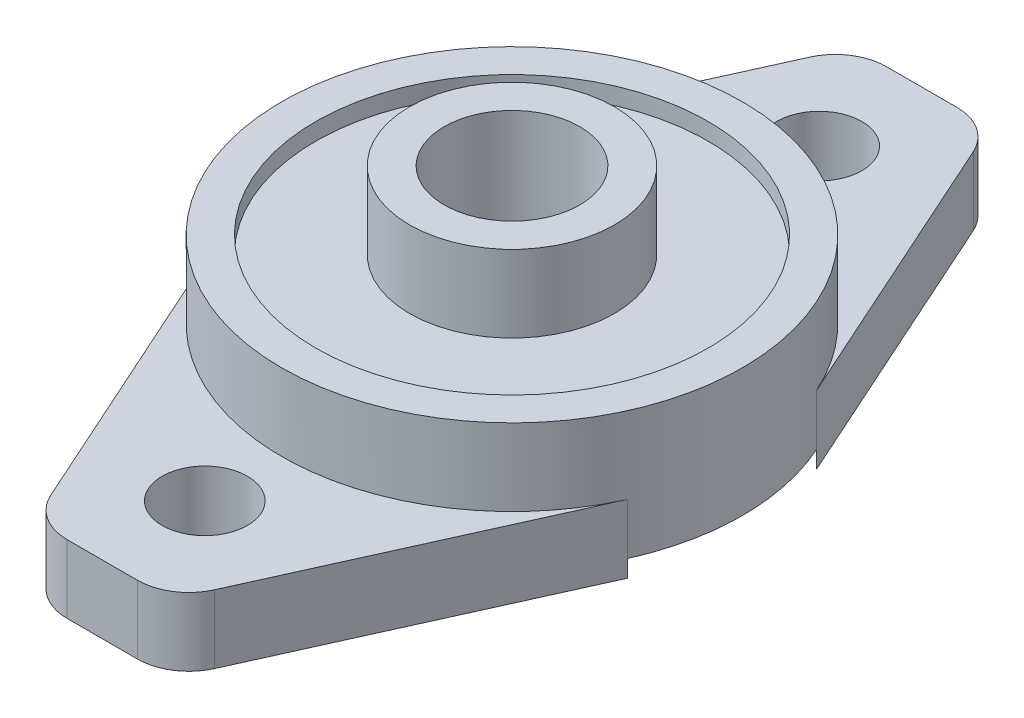
ISO-10303-21;
HEADER;
FILE_DESCRIPTION(('STEP AP214'),'2;1');
FILE_NAME('part.step','',(''),(''),'','','');
FILE_SCHEMA(('AUTOMOTIVE_DESIGN { 1 0 10303 214 1 1 1 1 }'));
ENDSEC;
DATA;
#1=APPLICATION_CONTEXT('core data for automotive mechanical design processes');
#2=APPLICATION_PROTOCOL_DEFINITION('international standard','automotive_design',2000,#1);
#3=PRODUCT_CONTEXT('',#1,'mechanical');
#4=PRODUCT('Part','Part','',(#3));
#5=PRODUCT_RELATED_PRODUCT_CATEGORY('part','',(#4));
#6=PRODUCT_DEFINITION_FORMATION('','',#4);
#7=PRODUCT_DEFINITION_CONTEXT('part definition',#1,'design');
#8=PRODUCT_DEFINITION('design','',#6,#7);
#9=PRODUCT_DEFINITION_SHAPE('','',#8);
#10=(LENGTH_UNIT() NAMED_UNIT(*) SI_UNIT(.MILLI.,.METRE.));
#11=(NAMED_UNIT(*) PLANE_ANGLE_UNIT() SI_UNIT($,.RADIAN.));
#12=(NAMED_UNIT(*) SI_UNIT($,.STERADIAN.) SOLID_ANGLE_UNIT());
#13=UNCERTAINTY_MEASURE_WITH_UNIT(LENGTH_MEASURE(1.E-05),#10,'distance_accuracy_value','');
#14=(GEOMETRIC_REPRESENTATION_CONTEXT(3) GLOBAL_UNCERTAINTY_ASSIGNED_CONTEXT((#13)) GLOBAL_UNIT_ASSIGNED_CONTEXT((#10,
#11,#12)) REPRESENTATION_CONTEXT('',''));
#15=CARTESIAN_POINT('',(0.,0.,0.));
#16=DIRECTION('',(0.,0.,1.));
#17=DIRECTION('',(1.,0.,0.));
#18=AXIS2_PLACEMENT_3D('',#15,#16,#17);
#19=CARTESIAN_POINT('',(0.,1.,0.));
#20=DIRECTION('',(0.,1.,0.));
#21=DIRECTION('',(0.,0.,1.));
#22=AXIS2_PLACEMENT_3D('',#19,#20,#21);
#23=PLANE('',#22);
#24=CARTESIAN_POINT('',(0.,1.,0.));
#25=DIRECTION('',(0.,1.,0.));
#26=DIRECTION('',(0.,0.,1.));
#27=AXIS2_PLACEMENT_3D('',#24,#25,#26);
#28=CIRCLE('',#27,13.5);
#29=CARTESIAN_POINT('',(12.3099654113498,1.,5.54208909810837));
#30=VERTEX_POINT('',#29);
#31=CARTESIAN_POINT('',(12.3099654113498,1.,-5.54208909810837));
#32=VERTEX_POINT('',#31);
#33=EDGE_CURVE('E155',#30,#32,#28,.T.);
#34=ORIENTED_EDGE('',*,*,#33,.F.);
#35=CARTESIAN_POINT('',(-12.3099654113498,1.,5.54208909810837));
#36=VERTEX_POINT('',#35);
#37=EDGE_CURVE('E141',#36,#30,#28,.T.);
#38=ORIENTED_EDGE('',*,*,#37,.F.);
#39=CARTESIAN_POINT('',(-12.3099654113498,1.,-5.54208909810837));
#40=VERTEX_POINT('',#39);
#41=EDGE_CURVE('E152',#40,#36,#28,.T.);
#42=ORIENTED_EDGE('',*,*,#41,.F.);
#43=EDGE_CURVE('E160',#32,#40,#28,.T.);
#44=ORIENTED_EDGE('',*,*,#43,.F.);
#45=EDGE_LOOP('',(#34,#38,#42,#44));
#46=FACE_BOUND('',#45,.T.);
#47=CARTESIAN_POINT('',(0.,1.,0.));
#48=DIRECTION('',(0.,1.,0.));
#49=DIRECTION('',(0.,0.,1.));
#50=AXIS2_PLACEMENT_3D('',#47,#48,#49);
#51=CIRCLE('',#50,11.5);
#52=CARTESIAN_POINT('',(0.,1.,11.5));
#53=VERTEX_POINT('',#52);
#54=EDGE_CURVE('E477',#53,#53,#51,.T.);
#55=ORIENTED_EDGE('',*,*,#54,.T.);
#56=EDGE_LOOP('',(#55));
#57=FACE_BOUND('',#56,.T.);
#58=ADVANCED_FACE('F38',(#46,#57),#23,.F.);
#59=CARTESIAN_POINT('',(0.,0.,0.));
#60=DIRECTION('',(0.,1.,0.));
#61=DIRECTION('',(0.,0.,1.));
#62=AXIS2_PLACEMENT_3D('',#59,#60,#61);
#63=PLANE('',#62);
#64=DIRECTION('',(1.,0.,0.));
#65=VECTOR('',#64,1.);
#66=CARTESIAN_POINT('',(0.,0.,-24.));
#67=LINE('',#66,#65);
#68=CARTESIAN_POINT('',(-2.06061740160023,0.,-24.));
#69=VERTEX_POINT('',#68);
#70=CARTESIAN_POINT('',(2.06061740160023,0.,-24.));
#71=VERTEX_POINT('',#70);
#72=EDGE_CURVE('E244',#69,#71,#67,.T.);
#73=ORIENTED_EDGE('',*,*,#72,.T.);
#74=CARTESIAN_POINT('',(2.06061740160023,0.,-21.));
#75=DIRECTION('',(0.,1.,0.));
#76=DIRECTION('',(0.,0.,1.));
#77=AXIS2_PLACEMENT_3D('',#74,#75,#76);
#78=CIRCLE('',#77,3.);
#79=CARTESIAN_POINT('',(4.79616527078907,0.,-22.2315753551352));
#80=VERTEX_POINT('',#79);
#81=EDGE_CURVE('E220',#71,#80,#78,.F.);
#82=ORIENTED_EDGE('',*,*,#81,.T.);
#83=DIRECTION('',(0.410525118378398,0.,0.911849289729615));
#84=VECTOR('',#83,1.);
#85=CARTESIAN_POINT('',(12.3099654113498,0.,-5.54208909810837));
#86=LINE('',#85,#84);
#87=CARTESIAN_POINT('',(12.3099654113498,0.,-5.54208909810837));
#88=VERTEX_POINT('',#87);
#89=EDGE_CURVE('E242',#80,#88,#86,.T.);
#90=ORIENTED_EDGE('',*,*,#89,.T.);
#91=CARTESIAN_POINT('',(0.,0.,0.));
#92=DIRECTION('',(0.,1.,0.));
#93=DIRECTION('',(0.,0.,1.));
#94=AXIS2_PLACEMENT_3D('',#91,#92,#93);
#95=CIRCLE('',#94,13.5);
#96=CARTESIAN_POINT('',(-12.3099654113498,0.,-5.54208909810837));
#97=VERTEX_POINT('',#96);
#98=EDGE_CURVE('E195',#97,#88,#95,.F.);
#99=ORIENTED_EDGE('',*,*,#98,.F.);
#100=DIRECTION('',(-0.410525118378398,0.,0.911849289729615));
#101=VECTOR('',#100,1.);
#102=CARTESIAN_POINT('',(-12.3099654113498,0.,-5.54208909810837));
#103=LINE('',#102,#101);
#104=CARTESIAN_POINT('',(-4.79616527078907,0.,-22.2315753551352));
#105=VERTEX_POINT('',#104);
#106=EDGE_CURVE('E279',#105,#97,#103,.T.);
#107=ORIENTED_EDGE('',*,*,#106,.F.);
#108=CARTESIAN_POINT('',(-2.06061740160023,0.,-21.));
#109=DIRECTION('',(0.,1.,0.));
#110=DIRECTION('',(0.,0.,1.));
#111=AXIS2_PLACEMENT_3D('',#108,#109,#110);
#112=CIRCLE('',#111,3.);
#113=EDGE_CURVE('E218',#105,#69,#112,.F.);
#114=ORIENTED_EDGE('',*,*,#113,.T.);
#115=EDGE_LOOP('',(#73,#82,#90,#99,#107,#114));
#116=FACE_BOUND('',#115,.T.);
#117=CARTESIAN_POINT('',(0.,0.,-18.));
#118=DIRECTION('',(0.,1.,0.));
#119=DIRECTION('',(0.,0.,1.));
#120=AXIS2_PLACEMENT_3D('',#117,#118,#119);
#121=CIRCLE('',#120,2.5);
#122=CARTESIAN_POINT('',(0.,0.,-15.5));
#123=VERTEX_POINT('',#122);
#124=EDGE_CURVE('E276',#123,#123,#121,.T.);
#125=ORIENTED_EDGE('',*,*,#124,.T.);
#126=EDGE_LOOP('',(#125));
#127=FACE_BOUND('',#126,.T.);
#128=ADVANCED_FACE('F239',(#116,#127),#63,.F.);
#129=CARTESIAN_POINT('',(0.,4.,0.));
#130=DIRECTION('',(0.,1.,0.));
#131=DIRECTION('',(0.,0.,1.));
#132=AXIS2_PLACEMENT_3D('',#129,#130,#131);
#133=PLANE('',#132);
#134=CARTESIAN_POINT('',(0.,4.,-18.));
#135=DIRECTION('',(0.,1.,0.));
#136=DIRECTION('',(0.,0.,1.));
#137=AXIS2_PLACEMENT_3D('',#134,#135,#136);
#138=CIRCLE('',#137,2.5);
#139=CARTESIAN_POINT('',(0.,4.,-15.5));
#140=VERTEX_POINT('',#139);
#141=EDGE_CURVE('E254',#140,#140,#138,.T.);
#142=ORIENTED_EDGE('',*,*,#141,.F.);
#143=EDGE_LOOP('',(#142));
#144=FACE_BOUND('',#143,.T.);
#145=DIRECTION('',(0.410525118378398,0.,0.911849289729615));
#146=VECTOR('',#145,1.);
#147=CARTESIAN_POINT('',(12.3099654113498,4.,-5.54208909810837));
#148=LINE('',#147,#146);
#149=CARTESIAN_POINT('',(4.79616527078907,4.,-22.2315753551352));
#150=VERTEX_POINT('',#149);
#151=CARTESIAN_POINT('',(12.3099654113498,4.,-5.54208909810837));
#152=VERTEX_POINT('',#151);
#153=EDGE_CURVE('E228',#150,#152,#148,.T.);
#154=ORIENTED_EDGE('',*,*,#153,.F.);
#155=CARTESIAN_POINT('',(2.06061740160023,4.,-21.));
#156=DIRECTION('',(0.,1.,0.));
#157=DIRECTION('',(0.,0.,1.));
#158=AXIS2_PLACEMENT_3D('',#155,#156,#157);
#159=CIRCLE('',#158,3.);
#160=CARTESIAN_POINT('',(2.06061740160023,4.,-24.));
#161=VERTEX_POINT('',#160);
#162=EDGE_CURVE('E46',#150,#161,#159,.T.);
#163=ORIENTED_EDGE('',*,*,#162,.T.);
#164=DIRECTION('',(1.,0.,0.));
#165=VECTOR('',#164,1.);
#166=CARTESIAN_POINT('',(0.,4.,-24.));
#167=LINE('',#166,#165);
#168=CARTESIAN_POINT('',(-2.06061740160023,4.,-24.));
#169=VERTEX_POINT('',#168);
#170=EDGE_CURVE('E226',#169,#161,#167,.T.);
#171=ORIENTED_EDGE('',*,*,#170,.F.);
#172=CARTESIAN_POINT('',(-2.06061740160023,4.,-21.));
#173=DIRECTION('',(0.,1.,0.));
#174=DIRECTION('',(0.,0.,1.));
#175=AXIS2_PLACEMENT_3D('',#172,#173,#174);
#176=CIRCLE('',#175,3.);
#177=CARTESIAN_POINT('',(-4.79616527078907,4.,-22.2315753551352));
#178=VERTEX_POINT('',#177);
#179=EDGE_CURVE('E53',#169,#178,#176,.T.);
#180=ORIENTED_EDGE('',*,*,#179,.T.);
#181=DIRECTION('',(-0.410525118378398,0.,0.911849289729615));
#182=VECTOR('',#181,1.);
#183=CARTESIAN_POINT('',(-12.3099654113498,4.,-5.54208909810837));
#184=LINE('',#183,#182);
#185=CARTESIAN_POINT('',(-12.3099654113498,4.,-5.54208909810837));
#186=VERTEX_POINT('',#185);
#187=EDGE_CURVE('E258',#178,#186,#184,.T.);
#188=ORIENTED_EDGE('',*,*,#187,.T.);
#189=CARTESIAN_POINT('',(0.,4.,0.));
#190=DIRECTION('',(0.,1.,0.));
#191=DIRECTION('',(0.,0.,1.));
#192=AXIS2_PLACEMENT_3D('',#189,#190,#191);
#193=CIRCLE('',#192,13.5);
#194=EDGE_CURVE('E280',#186,#152,#193,.F.);
#195=ORIENTED_EDGE('',*,*,#194,.T.);
#196=EDGE_LOOP('',(#154,#163,#171,#180,#188,#195));
#197=FACE_BOUND('',#196,.T.);
#198=ADVANCED_FACE('F225',(#144,#197),#133,.T.);
#199=CARTESIAN_POINT('',(-12.3099654113498,4.,-5.54208909810837));
#200=DIRECTION('',(0.911849289729615,0.,0.410525118378398));
#201=DIRECTION('',(0.410525118378398,0.,-0.911849289729614));
#202=AXIS2_PLACEMENT_3D('',#199,#200,#201);
#203=PLANE('',#202);
#204=ORIENTED_EDGE('',*,*,#187,.F.);
#205=DIRECTION('',(0.,-1.,0.));
#206=VECTOR('',#205,1.);
#207=CARTESIAN_POINT('',(-4.79616527078907,0.,-22.2315753551352));
#208=LINE('',#207,#206);
#209=EDGE_CURVE('E11',#178,#105,#208,.T.);
#210=ORIENTED_EDGE('',*,*,#209,.T.);
#211=ORIENTED_EDGE('',*,*,#106,.T.);
#212=DIRECTION('',(0.,-1.,0.));
#213=VECTOR('',#212,1.);
#214=CARTESIAN_POINT('',(-12.3099654113498,1.,-5.54208909810837));
#215=LINE('',#214,#213);
#216=EDGE_CURVE('E304',#97,#40,#215,.F.);
#217=ORIENTED_EDGE('',*,*,#216,.T.);
#218=DIRECTION('',(0.,-1.,0.));
#219=VECTOR('',#218,1.);
#220=CARTESIAN_POINT('',(-12.3099654113498,4.,-5.54208909810837));
#221=LINE('',#220,#219);
#222=EDGE_CURVE('E185',#186,#40,#221,.T.);
#223=ORIENTED_EDGE('',*,*,#222,.F.);
#224=EDGE_LOOP('',(#204,#210,#211,#217,#223));
#225=FACE_BOUND('',#224,.T.);
#226=ADVANCED_FACE('F317',(#225),#203,.F.);
#227=CARTESIAN_POINT('',(-12.3099654113498,4.,5.54208909810837));
#228=DIRECTION('',(-0.911849289729615,0.,0.410525118378398));
#229=DIRECTION('',(0.410525118378398,0.,0.911849289729614));
#230=AXIS2_PLACEMENT_3D('',#227,#228,#229);
#231=PLANE('',#230);
#232=DIRECTION('',(-0.410525118378398,0.,-0.911849289729615));
#233=VECTOR('',#232,1.);
#234=CARTESIAN_POINT('',(-12.3099654113498,0.,5.54208909810837));
#235=LINE('',#234,#233);
#236=CARTESIAN_POINT('',(-4.79616527078907,0.,22.2315753551352));
#237=VERTEX_POINT('',#236);
#238=CARTESIAN_POINT('',(-12.3099654113498,0.,5.54208909810837));
#239=VERTEX_POINT('',#238);
#240=EDGE_CURVE('E282',#237,#239,#235,.T.);
#241=ORIENTED_EDGE('',*,*,#240,.F.);
#242=DIRECTION('',(0.,-1.,0.));
#243=VECTOR('',#242,1.);
#244=CARTESIAN_POINT('',(-4.79616527078907,4.,22.2315753551352));
#245=LINE('',#244,#243);
#246=CARTESIAN_POINT('',(-4.79616527078907,4.,22.2315753551352));
#247=VERTEX_POINT('',#246);
#248=EDGE_CURVE('E211',#237,#247,#245,.F.);
#249=ORIENTED_EDGE('',*,*,#248,.T.);
#250=DIRECTION('',(-0.410525118378398,0.,-0.911849289729615));
#251=VECTOR('',#250,1.);
#252=CARTESIAN_POINT('',(-12.3099654113498,4.,5.54208909810837));
#253=LINE('',#252,#251);
#254=CARTESIAN_POINT('',(-12.3099654113498,4.,5.54208909810837));
#255=VERTEX_POINT('',#254);
#256=EDGE_CURVE('E262',#247,#255,#253,.T.);
#257=ORIENTED_EDGE('',*,*,#256,.T.);
#258=DIRECTION('',(0.,-1.,0.));
#259=VECTOR('',#258,1.);
#260=CARTESIAN_POINT('',(-12.3099654113498,4.,5.54208909810837));
#261=LINE('',#260,#259);
#262=EDGE_CURVE('E181',#255,#36,#261,.T.);
#263=ORIENTED_EDGE('',*,*,#262,.T.);
#264=DIRECTION('',(0.,-1.,0.));
#265=VECTOR('',#264,1.);
#266=CARTESIAN_POINT('',(-12.3099654113498,1.,5.54208909810837));
#267=LINE('',#266,#265);
#268=EDGE_CURVE('E149',#239,#36,#267,.F.);
#269=ORIENTED_EDGE('',*,*,#268,.F.);
#270=EDGE_LOOP('',(#241,#249,#257,#263,#269));
#271=FACE_BOUND('',#270,.T.);
#272=ADVANCED_FACE('F302',(#271),#231,.T.);
#273=CARTESIAN_POINT('',(0.,4.,24.));
#274=DIRECTION('',(0.,0.,-1.));
#275=DIRECTION('',(-1.,0.,0.));
#276=AXIS2_PLACEMENT_3D('',#273,#274,#275);
#277=PLANE('',#276);
#278=DIRECTION('',(1.,0.,0.));
#279=VECTOR('',#278,1.);
#280=CARTESIAN_POINT('',(0.,0.,24.));
#281=LINE('',#280,#279);
#282=CARTESIAN_POINT('',(-2.06061740160023,0.,24.));
#283=VERTEX_POINT('',#282);
#284=CARTESIAN_POINT('',(2.06061740160023,0.,24.));
#285=VERTEX_POINT('',#284);
#286=EDGE_CURVE('E250',#283,#285,#281,.T.);
#287=ORIENTED_EDGE('',*,*,#286,.T.);
#288=DIRECTION('',(0.,-1.,0.));
#289=VECTOR('',#288,1.);
#290=CARTESIAN_POINT('',(2.06061740160023,4.,24.));
#291=LINE('',#290,#289);
#292=CARTESIAN_POINT('',(2.06061740160023,4.,24.));
#293=VERTEX_POINT('',#292);
#294=EDGE_CURVE('E205',#285,#293,#291,.F.);
#295=ORIENTED_EDGE('',*,*,#294,.T.);
#296=DIRECTION('',(1.,0.,0.));
#297=VECTOR('',#296,1.);
#298=CARTESIAN_POINT('',(0.,4.,24.));
#299=LINE('',#298,#297);
#300=CARTESIAN_POINT('',(-2.06061740160023,4.,24.));
#301=VERTEX_POINT('',#300);
#302=EDGE_CURVE('E268',#301,#293,#299,.T.);
#303=ORIENTED_EDGE('',*,*,#302,.F.);
#304=DIRECTION('',(0.,-1.,0.));
#305=VECTOR('',#304,1.);
#306=CARTESIAN_POINT('',(-2.06061740160023,0.,24.));
#307=LINE('',#306,#305);
#308=EDGE_CURVE('E202',#301,#283,#307,.T.);
#309=ORIENTED_EDGE('',*,*,#308,.T.);
#310=EDGE_LOOP('',(#287,#295,#303,#309));
#311=FACE_BOUND('',#310,.T.);
#312=ADVANCED_FACE('F287',(#311),#277,.F.);
#313=CARTESIAN_POINT('',(12.3099654113498,4.,5.54208909810837));
#314=DIRECTION('',(-0.911849289729615,0.,-0.410525118378398));
#315=DIRECTION('',(-0.410525118378398,0.,0.911849289729614));
#316=AXIS2_PLACEMENT_3D('',#313,#314,#315);
#317=PLANE('',#316);
#318=DIRECTION('',(0.410525118378398,0.,-0.911849289729615));
#319=VECTOR('',#318,1.);
#320=CARTESIAN_POINT('',(12.3099654113498,4.,5.54208909810837));
#321=LINE('',#320,#319);
#322=CARTESIAN_POINT('',(4.79616527078907,4.,22.2315753551352));
#323=VERTEX_POINT('',#322);
#324=CARTESIAN_POINT('',(12.3099654113498,4.,5.54208909810837));
#325=VERTEX_POINT('',#324);
#326=EDGE_CURVE('E271',#323,#325,#321,.T.);
#327=ORIENTED_EDGE('',*,*,#326,.F.);
#328=DIRECTION('',(0.,-1.,0.));
#329=VECTOR('',#328,1.);
#330=CARTESIAN_POINT('',(4.79616527078907,4.,22.2315753551352));
#331=LINE('',#330,#329);
#332=CARTESIAN_POINT('',(4.79616527078907,0.,22.2315753551352));
#333=VERTEX_POINT('',#332);
#334=EDGE_CURVE('E196',#323,#333,#331,.T.);
#335=ORIENTED_EDGE('',*,*,#334,.T.);
#336=DIRECTION('',(0.410525118378398,0.,-0.911849289729615));
#337=VECTOR('',#336,1.);
#338=CARTESIAN_POINT('',(12.3099654113498,0.,5.54208909810837));
#339=LINE('',#338,#337);
#340=CARTESIAN_POINT('',(12.3099654113498,0.,5.54208909810837));
#341=VERTEX_POINT('',#340);
#342=EDGE_CURVE('E173',#333,#341,#339,.T.);
#343=ORIENTED_EDGE('',*,*,#342,.T.);
#344=DIRECTION('',(0.,-1.,0.));
#345=VECTOR('',#344,1.);
#346=CARTESIAN_POINT('',(12.3099654113498,1.,5.54208909810837));
#347=LINE('',#346,#345);
#348=EDGE_CURVE('E146',#341,#30,#347,.F.);
#349=ORIENTED_EDGE('',*,*,#348,.T.);
#350=DIRECTION('',(0.,-1.,0.));
#351=VECTOR('',#350,1.);
#352=CARTESIAN_POINT('',(12.3099654113498,4.,5.54208909810837));
#353=LINE('',#352,#351);
#354=EDGE_CURVE('E170',#325,#30,#353,.T.);
#355=ORIENTED_EDGE('',*,*,#354,.F.);
#356=EDGE_LOOP('',(#327,#335,#343,#349,#355));
#357=FACE_BOUND('',#356,.T.);
#358=ADVANCED_FACE('F169',(#357),#317,.F.);
#359=CARTESIAN_POINT('',(0.,4.,0.));
#360=DIRECTION('',(0.,-1.,0.));
#361=DIRECTION('',(0.,0.,-1.));
#362=AXIS2_PLACEMENT_3D('',#359,#360,#361);
#363=CYLINDRICAL_SURFACE('',#362,13.5);
#364=ORIENTED_EDGE('',*,*,#354,.T.);
#365=ORIENTED_EDGE('',*,*,#33,.T.);
#366=DIRECTION('',(0.,-1.,0.));
#367=VECTOR('',#366,1.);
#368=CARTESIAN_POINT('',(12.3099654113498,4.,-5.54208909810837));
#369=LINE('',#368,#367);
#370=EDGE_CURVE('E182',#152,#32,#369,.T.);
#371=ORIENTED_EDGE('',*,*,#370,.F.);
#372=ORIENTED_EDGE('',*,*,#194,.F.);
#373=ORIENTED_EDGE('',*,*,#222,.T.);
#374=ORIENTED_EDGE('',*,*,#41,.T.);
#375=ORIENTED_EDGE('',*,*,#262,.F.);
#376=EDGE_CURVE('E180',#325,#255,#193,.F.);
#377=ORIENTED_EDGE('',*,*,#376,.F.);
#378=EDGE_LOOP('',(#364,#365,#371,#372,#373,#374,#375,#377));
#379=FACE_BOUND('',#378,.T.);
#380=CARTESIAN_POINT('',(0.,8.5,0.));
#381=DIRECTION('',(0.,1.,0.));
#382=DIRECTION('',(0.,0.,1.));
#383=AXIS2_PLACEMENT_3D('',#380,#381,#382);
#384=CIRCLE('',#383,13.5);
#385=CARTESIAN_POINT('',(0.,8.5,13.5));
#386=VERTEX_POINT('',#385);
#387=EDGE_CURVE('E307',#386,#386,#384,.T.);
#388=ORIENTED_EDGE('',*,*,#387,.F.);
#389=EDGE_LOOP('',(#388));
#390=FACE_BOUND('',#389,.T.);
#391=ADVANCED_FACE('F176',(#379,#390),#363,.T.);
#392=CARTESIAN_POINT('',(12.3099654113498,4.,-5.54208909810837));
#393=DIRECTION('',(0.911849289729615,0.,-0.410525118378398));
#394=DIRECTION('',(-0.410525118378398,0.,-0.911849289729614));
#395=AXIS2_PLACEMENT_3D('',#392,#393,#394);
#396=PLANE('',#395);
#397=ORIENTED_EDGE('',*,*,#89,.F.);
#398=DIRECTION('',(0.,-1.,0.));
#399=VECTOR('',#398,1.);
#400=CARTESIAN_POINT('',(4.79616527078907,4.,-22.2315753551352));
#401=LINE('',#400,#399);
#402=EDGE_CURVE('E61',#80,#150,#401,.F.);
#403=ORIENTED_EDGE('',*,*,#402,.T.);
#404=ORIENTED_EDGE('',*,*,#153,.T.);
#405=ORIENTED_EDGE('',*,*,#370,.T.);
#406=DIRECTION('',(0.,-1.,0.));
#407=VECTOR('',#406,1.);
#408=CARTESIAN_POINT('',(12.3099654113498,1.,-5.54208909810837));
#409=LINE('',#408,#407);
#410=EDGE_CURVE('E165',#88,#32,#409,.F.);
#411=ORIENTED_EDGE('',*,*,#410,.F.);
#412=EDGE_LOOP('',(#397,#403,#404,#405,#411));
#413=FACE_BOUND('',#412,.T.);
#414=ADVANCED_FACE('F246',(#413),#396,.T.);
#415=CARTESIAN_POINT('',(0.,4.,-24.));
#416=DIRECTION('',(0.,0.,-1.));
#417=DIRECTION('',(-1.,0.,0.));
#418=AXIS2_PLACEMENT_3D('',#415,#416,#417);
#419=PLANE('',#418);
#420=ORIENTED_EDGE('',*,*,#170,.T.);
#421=DIRECTION('',(0.,-1.,0.));
#422=VECTOR('',#421,1.);
#423=CARTESIAN_POINT('',(2.06061740160023,4.,-24.));
#424=LINE('',#423,#422);
#425=EDGE_CURVE('E215',#161,#71,#424,.T.);
#426=ORIENTED_EDGE('',*,*,#425,.T.);
#427=ORIENTED_EDGE('',*,*,#72,.F.);
#428=DIRECTION('',(0.,-1.,0.));
#429=VECTOR('',#428,1.);
#430=CARTESIAN_POINT('',(-2.06061740160023,4.,-24.));
#431=LINE('',#430,#429);
#432=EDGE_CURVE('E213',#69,#169,#431,.F.);
#433=ORIENTED_EDGE('',*,*,#432,.T.);
#434=EDGE_LOOP('',(#420,#426,#427,#433));
#435=FACE_BOUND('',#434,.T.);
#436=ADVANCED_FACE('F232',(#435),#419,.T.);
#437=CARTESIAN_POINT('',(0.,4.,-18.));
#438=DIRECTION('',(0.,-1.,0.));
#439=DIRECTION('',(0.,0.,-1.));
#440=AXIS2_PLACEMENT_3D('',#437,#438,#439);
#441=CYLINDRICAL_SURFACE('',#440,2.5);
#442=ORIENTED_EDGE('',*,*,#141,.T.);
#443=EDGE_LOOP('',(#442));
#444=FACE_BOUND('',#443,.T.);
#445=ORIENTED_EDGE('',*,*,#124,.F.);
#446=EDGE_LOOP('',(#445));
#447=FACE_BOUND('',#446,.T.);
#448=ADVANCED_FACE('F357',(#444,#447),#441,.F.);
#449=CARTESIAN_POINT('',(0.,4.,18.));
#450=DIRECTION('',(0.,-1.,0.));
#451=DIRECTION('',(0.,0.,-1.));
#452=AXIS2_PLACEMENT_3D('',#449,#450,#451);
#453=CYLINDRICAL_SURFACE('',#452,2.5);
#454=CARTESIAN_POINT('',(0.,4.,18.));
#455=DIRECTION('',(0.,1.,0.));
#456=DIRECTION('',(0.,0.,1.));
#457=AXIS2_PLACEMENT_3D('',#454,#455,#456);
#458=CIRCLE('',#457,2.5);
#459=CARTESIAN_POINT('',(0.,4.,20.5));
#460=VERTEX_POINT('',#459);
#461=EDGE_CURVE('E187',#460,#460,#458,.F.);
#462=ORIENTED_EDGE('',*,*,#461,.F.);
#463=EDGE_LOOP('',(#462));
#464=FACE_BOUND('',#463,.T.);
#465=CARTESIAN_POINT('',(0.,0.,18.));
#466=DIRECTION('',(0.,1.,0.));
#467=DIRECTION('',(0.,0.,1.));
#468=AXIS2_PLACEMENT_3D('',#465,#466,#467);
#469=CIRCLE('',#468,2.5);
#470=CARTESIAN_POINT('',(0.,0.,20.5));
#471=VERTEX_POINT('',#470);
#472=EDGE_CURVE('E248',#471,#471,#469,.F.);
#473=ORIENTED_EDGE('',*,*,#472,.T.);
#474=EDGE_LOOP('',(#473));
#475=FACE_BOUND('',#474,.T.);
#476=ADVANCED_FACE('F352',(#464,#475),#453,.F.);
#477=ORIENTED_EDGE('',*,*,#302,.T.);
#478=CARTESIAN_POINT('',(2.06061740160023,4.,21.));
#479=DIRECTION('',(0.,1.,0.));
#480=DIRECTION('',(0.,0.,1.));
#481=AXIS2_PLACEMENT_3D('',#478,#479,#480);
#482=CIRCLE('',#481,3.);
#483=EDGE_CURVE('E209',#293,#323,#482,.T.);
#484=ORIENTED_EDGE('',*,*,#483,.T.);
#485=ORIENTED_EDGE('',*,*,#326,.T.);
#486=ORIENTED_EDGE('',*,*,#376,.T.);
#487=ORIENTED_EDGE('',*,*,#256,.F.);
#488=CARTESIAN_POINT('',(-2.06061740160023,4.,21.));
#489=DIRECTION('',(0.,1.,0.));
#490=DIRECTION('',(0.,0.,1.));
#491=AXIS2_PLACEMENT_3D('',#488,#489,#490);
#492=CIRCLE('',#491,3.);
#493=EDGE_CURVE('E207',#247,#301,#492,.T.);
#494=ORIENTED_EDGE('',*,*,#493,.T.);
#495=EDGE_LOOP('',(#477,#484,#485,#486,#487,#494));
#496=FACE_BOUND('',#495,.T.);
#497=ORIENTED_EDGE('',*,*,#461,.T.);
#498=EDGE_LOOP('',(#497));
#499=FACE_BOUND('',#498,.T.);
#500=ADVANCED_FACE('F296',(#496,#499),#133,.T.);
#501=ORIENTED_EDGE('',*,*,#342,.F.);
#502=CARTESIAN_POINT('',(2.06061740160023,0.,21.));
#503=DIRECTION('',(0.,1.,0.));
#504=DIRECTION('',(0.,0.,1.));
#505=AXIS2_PLACEMENT_3D('',#502,#503,#504);
#506=CIRCLE('',#505,3.);
#507=EDGE_CURVE('E200',#333,#285,#506,.F.);
#508=ORIENTED_EDGE('',*,*,#507,.T.);
#509=ORIENTED_EDGE('',*,*,#286,.F.);
#510=CARTESIAN_POINT('',(-2.06061740160023,0.,21.));
#511=DIRECTION('',(0.,1.,0.));
#512=DIRECTION('',(0.,0.,1.));
#513=AXIS2_PLACEMENT_3D('',#510,#511,#512);
#514=CIRCLE('',#513,3.);
#515=EDGE_CURVE('E198',#283,#237,#514,.F.);
#516=ORIENTED_EDGE('',*,*,#515,.T.);
#517=ORIENTED_EDGE('',*,*,#240,.T.);
#518=EDGE_CURVE('E193',#341,#239,#95,.F.);
#519=ORIENTED_EDGE('',*,*,#518,.F.);
#520=EDGE_LOOP('',(#501,#508,#509,#516,#517,#519));
#521=FACE_BOUND('',#520,.T.);
#522=ORIENTED_EDGE('',*,*,#472,.F.);
#523=EDGE_LOOP('',(#522));
#524=FACE_BOUND('',#523,.T.);
#525=ADVANCED_FACE('F298',(#521,#524),#63,.F.);
#526=CARTESIAN_POINT('',(0.,8.5,0.));
#527=DIRECTION('',(0.,1.,0.));
#528=DIRECTION('',(0.,0.,1.));
#529=AXIS2_PLACEMENT_3D('',#526,#527,#528);
#530=PLANE('',#529);
#531=CARTESIAN_POINT('',(0.,8.5,0.));
#532=DIRECTION('',(0.,1.,0.));
#533=DIRECTION('',(0.,0.,1.));
#534=AXIS2_PLACEMENT_3D('',#531,#532,#533);
#535=CIRCLE('',#534,11.5);
#536=CARTESIAN_POINT('',(0.,8.5,11.5));
#537=VERTEX_POINT('',#536);
#538=EDGE_CURVE('E468',#537,#537,#535,.T.);
#539=ORIENTED_EDGE('',*,*,#538,.F.);
#540=EDGE_LOOP('',(#539));
#541=FACE_BOUND('',#540,.T.);
#542=ORIENTED_EDGE('',*,*,#387,.T.);
#543=EDGE_LOOP('',(#542));
#544=FACE_BOUND('',#543,.T.);
#545=ADVANCED_FACE('F347',(#541,#544),#530,.T.);
#546=CARTESIAN_POINT('',(0.,1.,0.));
#547=DIRECTION('',(0.,-1.,0.));
#548=DIRECTION('',(0.,0.,-1.));
#549=AXIS2_PLACEMENT_3D('',#546,#547,#548);
#550=CYLINDRICAL_SURFACE('',#549,13.5);
#551=ORIENTED_EDGE('',*,*,#268,.T.);
#552=ORIENTED_EDGE('',*,*,#37,.T.);
#553=ORIENTED_EDGE('',*,*,#348,.F.);
#554=ORIENTED_EDGE('',*,*,#518,.T.);
#555=EDGE_LOOP('',(#551,#552,#553,#554));
#556=FACE_BOUND('',#555,.T.);
#557=ADVANCED_FACE('F143',(#556),#550,.F.);
#558=ORIENTED_EDGE('',*,*,#98,.T.);
#559=ORIENTED_EDGE('',*,*,#410,.T.);
#560=ORIENTED_EDGE('',*,*,#43,.T.);
#561=ORIENTED_EDGE('',*,*,#216,.F.);
#562=EDGE_LOOP('',(#558,#559,#560,#561));
#563=FACE_BOUND('',#562,.T.);
#564=ADVANCED_FACE('F322',(#563),#550,.F.);
#565=CARTESIAN_POINT('',(0.,12.,0.));
#566=DIRECTION('',(0.,-1.,0.));
#567=DIRECTION('',(0.,0.,-1.));
#568=AXIS2_PLACEMENT_3D('',#565,#566,#567);
#569=CYLINDRICAL_SURFACE('',#568,6.);
#570=CARTESIAN_POINT('',(0.,0.,0.));
#571=DIRECTION('',(0.,-1.,0.));
#572=DIRECTION('',(0.,0.,-1.));
#573=AXIS2_PLACEMENT_3D('',#570,#571,#572);
#574=CIRCLE('',#573,6.);
#575=CARTESIAN_POINT('',(0.,0.,-6.));
#576=VERTEX_POINT('',#575);
#577=EDGE_CURVE('E459',#576,#576,#574,.T.);
#578=ORIENTED_EDGE('',*,*,#577,.F.);
#579=EDGE_LOOP('',(#578));
#580=FACE_BOUND('',#579,.T.);
#581=CARTESIAN_POINT('',(0.,2.,0.));
#582=DIRECTION('',(0.,1.,0.));
#583=DIRECTION('',(0.,0.,1.));
#584=AXIS2_PLACEMENT_3D('',#581,#582,#583);
#585=CIRCLE('',#584,6.);
#586=CARTESIAN_POINT('',(0.,2.,6.));
#587=VERTEX_POINT('',#586);
#588=EDGE_CURVE('E480',#587,#587,#585,.T.);
#589=ORIENTED_EDGE('',*,*,#588,.F.);
#590=EDGE_LOOP('',(#589));
#591=FACE_BOUND('',#590,.T.);
#592=ADVANCED_FACE('F346',(#580,#591),#569,.T.);
#593=CARTESIAN_POINT('',(0.,12.,0.));
#594=DIRECTION('',(0.,-1.,0.));
#595=DIRECTION('',(0.,0.,-1.));
#596=AXIS2_PLACEMENT_3D('',#593,#594,#595);
#597=CIRCLE('',#596,6.);
#598=CARTESIAN_POINT('',(0.,12.,-6.));
#599=VERTEX_POINT('',#598);
#600=EDGE_CURVE('E153',#599,#599,#597,.T.);
#601=ORIENTED_EDGE('',*,*,#600,.T.);
#602=EDGE_LOOP('',(#601));
#603=FACE_BOUND('',#602,.T.);
#604=CARTESIAN_POINT('',(0.,7.5,0.));
#605=DIRECTION('',(0.,1.,0.));
#606=DIRECTION('',(0.,0.,1.));
#607=AXIS2_PLACEMENT_3D('',#604,#605,#606);
#608=CIRCLE('',#607,6.);
#609=CARTESIAN_POINT('',(0.,7.5,6.));
#610=VERTEX_POINT('',#609);
#611=EDGE_CURVE('E471',#610,#610,#608,.T.);
#612=ORIENTED_EDGE('',*,*,#611,.T.);
#613=EDGE_LOOP('',(#612));
#614=FACE_BOUND('',#613,.T.);
#615=ADVANCED_FACE('F342',(#603,#614),#569,.T.);
#616=CARTESIAN_POINT('',(0.,12.,0.));
#617=DIRECTION('',(0.,-1.,0.));
#618=DIRECTION('',(0.,0.,-1.));
#619=AXIS2_PLACEMENT_3D('',#616,#617,#618);
#620=PLANE('',#619);
#621=CARTESIAN_POINT('',(0.,12.,0.));
#622=DIRECTION('',(0.,-1.,0.));
#623=DIRECTION('',(0.,0.,-1.));
#624=AXIS2_PLACEMENT_3D('',#621,#622,#623);
#625=CIRCLE('',#624,3.97502081324319);
#626=CARTESIAN_POINT('',(0.,12.,-3.97502081324319));
#627=VERTEX_POINT('',#626);
#628=EDGE_CURVE('E455',#627,#627,#625,.T.);
#629=ORIENTED_EDGE('',*,*,#628,.T.);
#630=EDGE_LOOP('',(#629));
#631=FACE_BOUND('',#630,.T.);
#632=ORIENTED_EDGE('',*,*,#600,.F.);
#633=EDGE_LOOP('',(#632));
#634=FACE_BOUND('',#633,.T.);
#635=ADVANCED_FACE('F445',(#631,#634),#620,.F.);
#636=CARTESIAN_POINT('',(0.,12.,0.));
#637=DIRECTION('',(0.,-1.,0.));
#638=DIRECTION('',(0.,0.,-1.));
#639=AXIS2_PLACEMENT_3D('',#636,#637,#638);
#640=CYLINDRICAL_SURFACE('',#639,3.97502081324319);
#641=ORIENTED_EDGE('',*,*,#628,.F.);
#642=EDGE_LOOP('',(#641));
#643=FACE_BOUND('',#642,.T.);
#644=CARTESIAN_POINT('',(0.,0.,0.));
#645=DIRECTION('',(0.,-1.,0.));
#646=DIRECTION('',(0.,0.,-1.));
#647=AXIS2_PLACEMENT_3D('',#644,#645,#646);
#648=CIRCLE('',#647,3.97502081324319);
#649=CARTESIAN_POINT('',(0.,0.,-3.97502081324319));
#650=VERTEX_POINT('',#649);
#651=EDGE_CURVE('E464',#650,#650,#648,.T.);
#652=ORIENTED_EDGE('',*,*,#651,.T.);
#653=EDGE_LOOP('',(#652));
#654=FACE_BOUND('',#653,.T.);
#655=ADVANCED_FACE('F442',(#643,#654),#640,.F.);
#656=CARTESIAN_POINT('',(0.,0.,0.));
#657=DIRECTION('',(0.,-1.,0.));
#658=DIRECTION('',(0.,0.,-1.));
#659=AXIS2_PLACEMENT_3D('',#656,#657,#658);
#660=PLANE('',#659);
#661=ORIENTED_EDGE('',*,*,#577,.T.);
#662=EDGE_LOOP('',(#661));
#663=FACE_BOUND('',#662,.T.);
#664=ORIENTED_EDGE('',*,*,#651,.F.);
#665=EDGE_LOOP('',(#664));
#666=FACE_BOUND('',#665,.T.);
#667=ADVANCED_FACE('F438',(#663,#666),#660,.T.);
#668=CARTESIAN_POINT('',(0.,7.5,0.));
#669=DIRECTION('',(0.,1.,0.));
#670=DIRECTION('',(0.,0.,1.));
#671=AXIS2_PLACEMENT_3D('',#668,#669,#670);
#672=CYLINDRICAL_SURFACE('',#671,11.5);
#673=CARTESIAN_POINT('',(0.,7.5,0.));
#674=DIRECTION('',(0.,1.,0.));
#675=DIRECTION('',(0.,0.,1.));
#676=AXIS2_PLACEMENT_3D('',#673,#674,#675);
#677=CIRCLE('',#676,11.5);
#678=CARTESIAN_POINT('',(0.,7.5,11.5));
#679=VERTEX_POINT('',#678);
#680=EDGE_CURVE('E467',#679,#679,#677,.T.);
#681=ORIENTED_EDGE('',*,*,#680,.F.);
#682=EDGE_LOOP('',(#681));
#683=FACE_BOUND('',#682,.T.);
#684=ORIENTED_EDGE('',*,*,#538,.T.);
#685=EDGE_LOOP('',(#684));
#686=FACE_BOUND('',#685,.T.);
#687=ADVANCED_FACE('F434',(#683,#686),#672,.F.);
#688=CARTESIAN_POINT('',(0.,7.5,0.));
#689=DIRECTION('',(0.,1.,0.));
#690=DIRECTION('',(0.,0.,1.));
#691=AXIS2_PLACEMENT_3D('',#688,#689,#690);
#692=PLANE('',#691);
#693=ORIENTED_EDGE('',*,*,#611,.F.);
#694=EDGE_LOOP('',(#693));
#695=FACE_BOUND('',#694,.T.);
#696=ORIENTED_EDGE('',*,*,#680,.T.);
#697=EDGE_LOOP('',(#696));
#698=FACE_BOUND('',#697,.T.);
#699=ADVANCED_FACE('F377',(#695,#698),#692,.T.);
#700=CARTESIAN_POINT('',(2.06061740160023,4.,21.));
#701=DIRECTION('',(0.,-1.,0.));
#702=DIRECTION('',(0.,0.,-1.));
#703=AXIS2_PLACEMENT_3D('',#700,#701,#702);
#704=CYLINDRICAL_SURFACE('',#703,3.);
#705=ORIENTED_EDGE('',*,*,#483,.F.);
#706=ORIENTED_EDGE('',*,*,#294,.F.);
#707=ORIENTED_EDGE('',*,*,#507,.F.);
#708=ORIENTED_EDGE('',*,*,#334,.F.);
#709=EDGE_LOOP('',(#705,#706,#707,#708));
#710=FACE_BOUND('',#709,.T.);
#711=ADVANCED_FACE('F293',(#710),#704,.T.);
#712=CARTESIAN_POINT('',(-2.06061740160023,4.,21.));
#713=DIRECTION('',(0.,1.,0.));
#714=DIRECTION('',(0.,0.,1.));
#715=AXIS2_PLACEMENT_3D('',#712,#713,#714);
#716=CYLINDRICAL_SURFACE('',#715,3.);
#717=ORIENTED_EDGE('',*,*,#493,.F.);
#718=ORIENTED_EDGE('',*,*,#248,.F.);
#719=ORIENTED_EDGE('',*,*,#515,.F.);
#720=ORIENTED_EDGE('',*,*,#308,.F.);
#721=EDGE_LOOP('',(#717,#718,#719,#720));
#722=FACE_BOUND('',#721,.T.);
#723=ADVANCED_FACE('F333',(#722),#716,.T.);
#724=CARTESIAN_POINT('',(2.06061740160023,4.,-21.));
#725=DIRECTION('',(0.,-1.,0.));
#726=DIRECTION('',(0.,0.,-1.));
#727=AXIS2_PLACEMENT_3D('',#724,#725,#726);
#728=CYLINDRICAL_SURFACE('',#727,3.);
#729=ORIENTED_EDGE('',*,*,#162,.F.);
#730=ORIENTED_EDGE('',*,*,#402,.F.);
#731=ORIENTED_EDGE('',*,*,#81,.F.);
#732=ORIENTED_EDGE('',*,*,#425,.F.);
#733=EDGE_LOOP('',(#729,#730,#731,#732));
#734=FACE_BOUND('',#733,.T.);
#735=ADVANCED_FACE('F237',(#734),#728,.T.);
#736=CARTESIAN_POINT('',(-2.06061740160023,4.,-21.));
#737=DIRECTION('',(0.,1.,0.));
#738=DIRECTION('',(0.,0.,1.));
#739=AXIS2_PLACEMENT_3D('',#736,#737,#738);
#740=CYLINDRICAL_SURFACE('',#739,3.);
#741=ORIENTED_EDGE('',*,*,#179,.F.);
#742=ORIENTED_EDGE('',*,*,#432,.F.);
#743=ORIENTED_EDGE('',*,*,#113,.F.);
#744=ORIENTED_EDGE('',*,*,#209,.F.);
#745=EDGE_LOOP('',(#741,#742,#743,#744));
#746=FACE_BOUND('',#745,.T.);
#747=ADVANCED_FACE('F40',(#746),#740,.T.);
#748=CARTESIAN_POINT('',(0.,2.,0.));
#749=DIRECTION('',(0.,1.,0.));
#750=DIRECTION('',(0.,0.,1.));
#751=AXIS2_PLACEMENT_3D('',#748,#749,#750);
#752=PLANE('',#751);
#753=CARTESIAN_POINT('',(0.,2.,0.));
#754=DIRECTION('',(0.,1.,0.));
#755=DIRECTION('',(0.,0.,1.));
#756=AXIS2_PLACEMENT_3D('',#753,#754,#755);
#757=CIRCLE('',#756,11.5);
#758=CARTESIAN_POINT('',(0.,2.,11.5));
#759=VERTEX_POINT('',#758);
#760=EDGE_CURVE('E476',#759,#759,#757,.T.);
#761=ORIENTED_EDGE('',*,*,#760,.F.);
#762=EDGE_LOOP('',(#761));
#763=FACE_BOUND('',#762,.T.);
#764=ORIENTED_EDGE('',*,*,#588,.T.);
#765=EDGE_LOOP('',(#764));
#766=FACE_BOUND('',#765,.T.);
#767=ADVANCED_FACE('F325',(#763,#766),#752,.F.);
#768=CARTESIAN_POINT('',(0.,2.,0.));
#769=DIRECTION('',(0.,-1.,0.));
#770=DIRECTION('',(0.,0.,-1.));
#771=AXIS2_PLACEMENT_3D('',#768,#769,#770);
#772=CYLINDRICAL_SURFACE('',#771,11.5);
#773=ORIENTED_EDGE('',*,*,#760,.T.);
#774=EDGE_LOOP('',(#773));
#775=FACE_BOUND('',#774,.T.);
#776=ORIENTED_EDGE('',*,*,#54,.F.);
#777=EDGE_LOOP('',(#776));
#778=FACE_BOUND('',#777,.T.);
#779=ADVANCED_FACE('F330',(#775,#778),#772,.F.);
#780=CLOSED_SHELL('',(#58,#128,#198,#226,#272,#312,#358,#391,#414,#436,#448,#476,#500,#525,#545,
#557,#564,#592,#615,#635,#655,#667,#687,#699,#711,#723,#735,#747,#767,#779));
#781=MANIFOLD_SOLID_BREP('B2',#780);
#782=ADVANCED_BREP_SHAPE_REPRESENTATION('',(#18,#781),#14);
#783=SHAPE_DEFINITION_REPRESENTATION(#9,#782);
ENDSEC;
END-ISO-10303-21;
